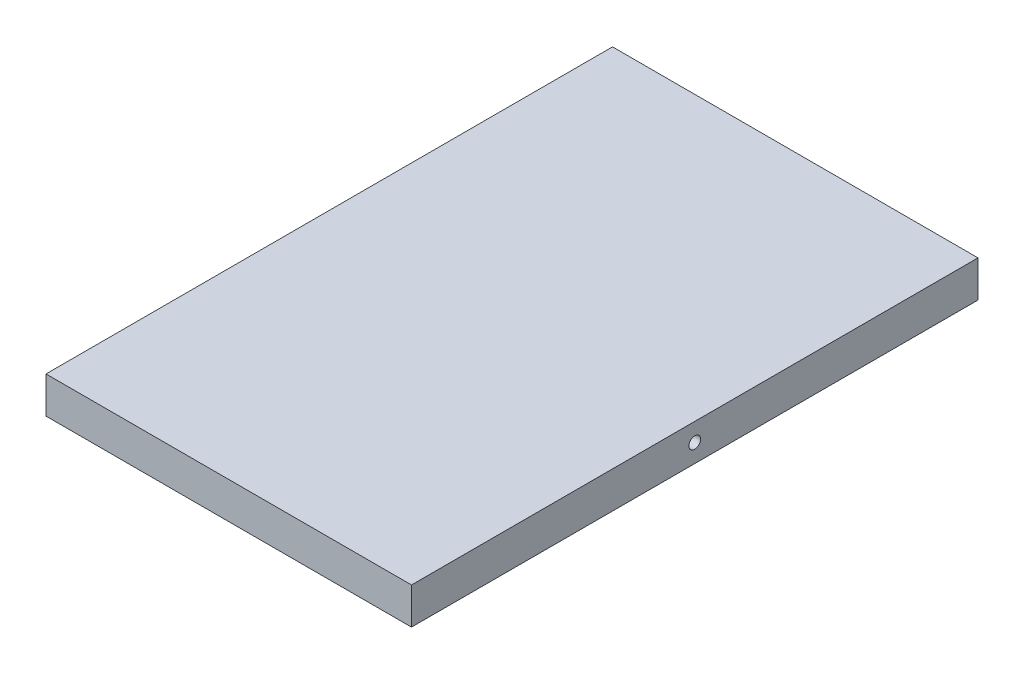
ISO-10303-21;
HEADER;
FILE_DESCRIPTION(('STEP AP214'),'2;1');
FILE_NAME('part.step','',(''),(''),'','','');
FILE_SCHEMA(('AUTOMOTIVE_DESIGN { 1 0 10303 214 1 1 1 1 }'));
ENDSEC;
DATA;
#1=APPLICATION_CONTEXT('core data for automotive mechanical design processes');
#2=APPLICATION_PROTOCOL_DEFINITION('international standard','automotive_design',2000,#1);
#3=PRODUCT_CONTEXT('',#1,'mechanical');
#4=PRODUCT('Part','Part','',(#3));
#5=PRODUCT_RELATED_PRODUCT_CATEGORY('part','',(#4));
#6=PRODUCT_DEFINITION_FORMATION('','',#4);
#7=PRODUCT_DEFINITION_CONTEXT('part definition',#1,'design');
#8=PRODUCT_DEFINITION('design','',#6,#7);
#9=PRODUCT_DEFINITION_SHAPE('','',#8);
#10=(LENGTH_UNIT() NAMED_UNIT(*) SI_UNIT(.MILLI.,.METRE.));
#11=(NAMED_UNIT(*) PLANE_ANGLE_UNIT() SI_UNIT($,.RADIAN.));
#12=(NAMED_UNIT(*) SI_UNIT($,.STERADIAN.) SOLID_ANGLE_UNIT());
#13=UNCERTAINTY_MEASURE_WITH_UNIT(LENGTH_MEASURE(1.E-05),#10,'distance_accuracy_value','');
#14=(GEOMETRIC_REPRESENTATION_CONTEXT(3) GLOBAL_UNCERTAINTY_ASSIGNED_CONTEXT((#13)) GLOBAL_UNIT_ASSIGNED_CONTEXT((#10,
#11,#12)) REPRESENTATION_CONTEXT('',''));
#15=CARTESIAN_POINT('',(0.,0.,0.));
#16=DIRECTION('',(0.,0.,1.));
#17=DIRECTION('',(1.,0.,0.));
#18=AXIS2_PLACEMENT_3D('',#15,#16,#17);
#19=CARTESIAN_POINT('',(0.,50.,0.));
#20=DIRECTION('',(1.,0.,0.));
#21=DIRECTION('',(0.,0.,-1.));
#22=AXIS2_PLACEMENT_3D('',#19,#20,#21);
#23=PLANE('',#22);
#24=CARTESIAN_POINT('',(0.,25.,-387.5));
#25=DIRECTION('',(-1.,0.,0.));
#26=DIRECTION('',(0.,0.,1.));
#27=AXIS2_PLACEMENT_3D('',#24,#25,#26);
#28=CIRCLE('',#27,7.99999999999998);
#29=CARTESIAN_POINT('',(0.,25.,-379.5));
#30=VERTEX_POINT('',#29);
#31=EDGE_CURVE('E170',#30,#30,#28,.T.);
#32=ORIENTED_EDGE('',*,*,#31,.F.);
#33=EDGE_LOOP('',(#32));
#34=FACE_BOUND('',#33,.T.);
#35=DIRECTION('',(0.,0.,1.));
#36=VECTOR('',#35,1.);
#37=CARTESIAN_POINT('',(0.,0.,0.));
#38=LINE('',#37,#36);
#39=CARTESIAN_POINT('',(0.,0.,-775.));
#40=VERTEX_POINT('',#39);
#41=CARTESIAN_POINT('',(0.,0.,0.));
#42=VERTEX_POINT('',#41);
#43=EDGE_CURVE('E101',#40,#42,#38,.T.);
#44=ORIENTED_EDGE('',*,*,#43,.T.);
#45=DIRECTION('',(0.,-1.,0.));
#46=VECTOR('',#45,1.);
#47=CARTESIAN_POINT('',(0.,50.,0.));
#48=LINE('',#47,#46);
#49=CARTESIAN_POINT('',(0.,50.,0.));
#50=VERTEX_POINT('',#49);
#51=EDGE_CURVE('E92',#50,#42,#48,.T.);
#52=ORIENTED_EDGE('',*,*,#51,.F.);
#53=DIRECTION('',(0.,0.,1.));
#54=VECTOR('',#53,1.);
#55=CARTESIAN_POINT('',(0.,50.,0.));
#56=LINE('',#55,#54);
#57=CARTESIAN_POINT('',(0.,50.,-775.));
#58=VERTEX_POINT('',#57);
#59=EDGE_CURVE('E86',#58,#50,#56,.T.);
#60=ORIENTED_EDGE('',*,*,#59,.F.);
#61=DIRECTION('',(0.,-1.,0.));
#62=VECTOR('',#61,1.);
#63=CARTESIAN_POINT('',(0.,50.,-775.));
#64=LINE('',#63,#62);
#65=EDGE_CURVE('E97',#58,#40,#64,.T.);
#66=ORIENTED_EDGE('',*,*,#65,.T.);
#67=EDGE_LOOP('',(#44,#52,#60,#66));
#68=FACE_BOUND('',#67,.T.);
#69=ADVANCED_FACE('F33',(#34,#68),#23,.F.);
#70=CARTESIAN_POINT('',(0.,50.,0.));
#71=DIRECTION('',(0.,0.,-1.));
#72=DIRECTION('',(-1.,0.,0.));
#73=AXIS2_PLACEMENT_3D('',#70,#71,#72);
#74=PLANE('',#73);
#75=DIRECTION('',(1.,0.,0.));
#76=VECTOR('',#75,1.);
#77=CARTESIAN_POINT('',(0.,0.,0.));
#78=LINE('',#77,#76);
#79=CARTESIAN_POINT('',(500.,0.,0.));
#80=VERTEX_POINT('',#79);
#81=EDGE_CURVE('E91',#42,#80,#78,.T.);
#82=ORIENTED_EDGE('',*,*,#81,.T.);
#83=DIRECTION('',(0.,-1.,0.));
#84=VECTOR('',#83,1.);
#85=CARTESIAN_POINT('',(500.,50.,0.));
#86=LINE('',#85,#84);
#87=CARTESIAN_POINT('',(500.,50.,0.));
#88=VERTEX_POINT('',#87);
#89=EDGE_CURVE('E89',#88,#80,#86,.T.);
#90=ORIENTED_EDGE('',*,*,#89,.F.);
#91=DIRECTION('',(1.,0.,0.));
#92=VECTOR('',#91,1.);
#93=CARTESIAN_POINT('',(0.,50.,0.));
#94=LINE('',#93,#92);
#95=EDGE_CURVE('E81',#50,#88,#94,.T.);
#96=ORIENTED_EDGE('',*,*,#95,.F.);
#97=ORIENTED_EDGE('',*,*,#51,.T.);
#98=EDGE_LOOP('',(#82,#90,#96,#97));
#99=FACE_BOUND('',#98,.T.);
#100=ADVANCED_FACE('F90',(#99),#74,.F.);
#101=CARTESIAN_POINT('',(500.,50.,0.));
#102=DIRECTION('',(-1.,0.,0.));
#103=DIRECTION('',(0.,0.,1.));
#104=AXIS2_PLACEMENT_3D('',#101,#102,#103);
#105=PLANE('',#104);
#106=CARTESIAN_POINT('',(500.,25.,-387.5));
#107=DIRECTION('',(1.,0.,0.));
#108=DIRECTION('',(0.,0.,-1.));
#109=AXIS2_PLACEMENT_3D('',#106,#107,#108);
#110=CIRCLE('',#109,7.99999999999998);
#111=CARTESIAN_POINT('',(500.,25.,-395.5));
#112=VERTEX_POINT('',#111);
#113=EDGE_CURVE('E177',#112,#112,#110,.T.);
#114=ORIENTED_EDGE('',*,*,#113,.F.);
#115=EDGE_LOOP('',(#114));
#116=FACE_BOUND('',#115,.T.);
#117=DIRECTION('',(0.,0.,-1.));
#118=VECTOR('',#117,1.);
#119=CARTESIAN_POINT('',(500.,0.,0.));
#120=LINE('',#119,#118);
#121=CARTESIAN_POINT('',(500.,0.,-775.));
#122=VERTEX_POINT('',#121);
#123=EDGE_CURVE('E67',#80,#122,#120,.T.);
#124=ORIENTED_EDGE('',*,*,#123,.T.);
#125=DIRECTION('',(0.,-1.,0.));
#126=VECTOR('',#125,1.);
#127=CARTESIAN_POINT('',(500.,50.,-775.));
#128=LINE('',#127,#126);
#129=CARTESIAN_POINT('',(500.,50.,-775.));
#130=VERTEX_POINT('',#129);
#131=EDGE_CURVE('E93',#130,#122,#128,.T.);
#132=ORIENTED_EDGE('',*,*,#131,.F.);
#133=DIRECTION('',(0.,0.,-1.));
#134=VECTOR('',#133,1.);
#135=CARTESIAN_POINT('',(500.,50.,0.));
#136=LINE('',#135,#134);
#137=EDGE_CURVE('E84',#88,#130,#136,.T.);
#138=ORIENTED_EDGE('',*,*,#137,.F.);
#139=ORIENTED_EDGE('',*,*,#89,.T.);
#140=EDGE_LOOP('',(#124,#132,#138,#139));
#141=FACE_BOUND('',#140,.T.);
#142=ADVANCED_FACE('F95',(#116,#141),#105,.F.);
#143=CARTESIAN_POINT('',(0.,50.,-775.));
#144=DIRECTION('',(0.,0.,1.));
#145=DIRECTION('',(1.,0.,0.));
#146=AXIS2_PLACEMENT_3D('',#143,#144,#145);
#147=PLANE('',#146);
#148=DIRECTION('',(-1.,0.,0.));
#149=VECTOR('',#148,1.);
#150=CARTESIAN_POINT('',(0.,0.,-775.));
#151=LINE('',#150,#149);
#152=EDGE_CURVE('E73',#122,#40,#151,.T.);
#153=ORIENTED_EDGE('',*,*,#152,.T.);
#154=ORIENTED_EDGE('',*,*,#65,.F.);
#155=DIRECTION('',(-1.,0.,0.));
#156=VECTOR('',#155,1.);
#157=CARTESIAN_POINT('',(0.,50.,-775.));
#158=LINE('',#157,#156);
#159=EDGE_CURVE('E50',#130,#58,#158,.T.);
#160=ORIENTED_EDGE('',*,*,#159,.F.);
#161=ORIENTED_EDGE('',*,*,#131,.T.);
#162=EDGE_LOOP('',(#153,#154,#160,#161));
#163=FACE_BOUND('',#162,.T.);
#164=ADVANCED_FACE('F136',(#163),#147,.F.);
#165=CARTESIAN_POINT('',(0.,50.,0.));
#166=DIRECTION('',(0.,-1.,0.));
#167=DIRECTION('',(0.,0.,-1.));
#168=AXIS2_PLACEMENT_3D('',#165,#166,#167);
#169=PLANE('',#168);
#170=ORIENTED_EDGE('',*,*,#59,.T.);
#171=ORIENTED_EDGE('',*,*,#95,.T.);
#172=ORIENTED_EDGE('',*,*,#137,.T.);
#173=ORIENTED_EDGE('',*,*,#159,.T.);
#174=EDGE_LOOP('',(#170,#171,#172,#173));
#175=FACE_BOUND('',#174,.T.);
#176=ADVANCED_FACE('F82',(#175),#169,.F.);
#177=CARTESIAN_POINT('',(0.,0.,0.));
#178=DIRECTION('',(0.,-1.,0.));
#179=DIRECTION('',(0.,0.,-1.));
#180=AXIS2_PLACEMENT_3D('',#177,#178,#179);
#181=PLANE('',#180);
#182=CARTESIAN_POINT('',(250.,0.,-100.));
#183=DIRECTION('',(0.,-1.,0.));
#184=DIRECTION('',(0.,0.,-1.));
#185=AXIS2_PLACEMENT_3D('',#182,#183,#184);
#186=CIRCLE('',#185,66.5482774756152);
#187=CARTESIAN_POINT('',(250.,0.,-166.548277475615));
#188=VERTEX_POINT('',#187);
#189=EDGE_CURVE('E169',#188,#188,#186,.T.);
#190=ORIENTED_EDGE('',*,*,#189,.F.);
#191=EDGE_LOOP('',(#190));
#192=FACE_BOUND('',#191,.T.);
#193=ORIENTED_EDGE('',*,*,#43,.F.);
#194=ORIENTED_EDGE('',*,*,#152,.F.);
#195=ORIENTED_EDGE('',*,*,#123,.F.);
#196=ORIENTED_EDGE('',*,*,#81,.F.);
#197=EDGE_LOOP('',(#193,#194,#195,#196));
#198=FACE_BOUND('',#197,.T.);
#199=ADVANCED_FACE('F140',(#192,#198),#181,.T.);
#200=CARTESIAN_POINT('',(455.,25.,-387.5));
#201=DIRECTION('',(1.,0.,0.));
#202=DIRECTION('',(0.,0.,-1.));
#203=AXIS2_PLACEMENT_3D('',#200,#201,#202);
#204=CYLINDRICAL_SURFACE('',#203,7.99999999999998);
#205=CARTESIAN_POINT('',(455.,25.,-387.5));
#206=DIRECTION('',(1.,0.,0.));
#207=DIRECTION('',(0.,0.,-1.));
#208=AXIS2_PLACEMENT_3D('',#205,#206,#207);
#209=CIRCLE('',#208,7.99999999999998);
#210=CARTESIAN_POINT('',(455.,25.,-395.5));
#211=VERTEX_POINT('',#210);
#212=EDGE_CURVE('E104',#211,#211,#209,.T.);
#213=CARTESIAN_POINT('',(455.,25.,-395.5));
#214=CARTESIAN_POINT('',(455.46875,25.,-395.5));
#215=CARTESIAN_POINT('',(455.9375,25.,-395.5));
#216=CARTESIAN_POINT('',(456.875,25.,-395.5));
#217=CARTESIAN_POINT('',(457.34375,25.,-395.5));
#218=CARTESIAN_POINT('',(458.28125,25.,-395.5));
#219=CARTESIAN_POINT('',(458.75,25.,-395.5));
#220=CARTESIAN_POINT('',(459.6875,25.,-395.5));
#221=CARTESIAN_POINT('',(460.15625,25.,-395.5));
#222=CARTESIAN_POINT('',(461.09375,25.,-395.5));
#223=CARTESIAN_POINT('',(461.5625,25.,-395.5));
#224=CARTESIAN_POINT('',(462.5,25.,-395.5));
#225=CARTESIAN_POINT('',(462.96875,25.,-395.5));
#226=CARTESIAN_POINT('',(463.90625,25.,-395.5));
#227=CARTESIAN_POINT('',(464.375,25.,-395.5));
#228=CARTESIAN_POINT('',(465.3125,25.,-395.5));
#229=CARTESIAN_POINT('',(465.78125,25.,-395.5));
#230=CARTESIAN_POINT('',(466.71875,25.,-395.5));
#231=CARTESIAN_POINT('',(467.1875,25.,-395.5));
#232=CARTESIAN_POINT('',(468.125,25.,-395.5));
#233=CARTESIAN_POINT('',(468.59375,25.,-395.5));
#234=CARTESIAN_POINT('',(469.53125,25.,-395.5));
#235=CARTESIAN_POINT('',(470.,25.,-395.5));
#236=CARTESIAN_POINT('',(470.9375,25.,-395.5));
#237=CARTESIAN_POINT('',(471.40625,25.,-395.5));
#238=CARTESIAN_POINT('',(472.34375,25.,-395.5));
#239=CARTESIAN_POINT('',(472.8125,25.,-395.5));
#240=CARTESIAN_POINT('',(473.75,25.,-395.5));
#241=CARTESIAN_POINT('',(474.21875,25.,-395.5));
#242=CARTESIAN_POINT('',(475.15625,25.,-395.5));
#243=CARTESIAN_POINT('',(475.625,25.,-395.5));
#244=CARTESIAN_POINT('',(476.5625,25.,-395.5));
#245=CARTESIAN_POINT('',(477.03125,25.,-395.5));
#246=CARTESIAN_POINT('',(477.96875,25.,-395.5));
#247=CARTESIAN_POINT('',(478.4375,25.,-395.5));
#248=CARTESIAN_POINT('',(479.375,25.,-395.5));
#249=CARTESIAN_POINT('',(479.84375,25.,-395.5));
#250=CARTESIAN_POINT('',(480.78125,25.,-395.5));
#251=CARTESIAN_POINT('',(481.25,25.,-395.5));
#252=CARTESIAN_POINT('',(482.1875,25.,-395.5));
#253=CARTESIAN_POINT('',(482.65625,25.,-395.5));
#254=CARTESIAN_POINT('',(483.59375,25.,-395.5));
#255=CARTESIAN_POINT('',(484.0625,25.,-395.5));
#256=CARTESIAN_POINT('',(485.,25.,-395.5));
#257=CARTESIAN_POINT('',(485.46875,25.,-395.5));
#258=CARTESIAN_POINT('',(486.40625,25.,-395.5));
#259=CARTESIAN_POINT('',(486.875,25.,-395.5));
#260=CARTESIAN_POINT('',(487.8125,25.,-395.5));
#261=CARTESIAN_POINT('',(488.28125,25.,-395.5));
#262=CARTESIAN_POINT('',(489.21875,25.,-395.5));
#263=CARTESIAN_POINT('',(489.6875,25.,-395.5));
#264=CARTESIAN_POINT('',(490.625,25.,-395.5));
#265=CARTESIAN_POINT('',(491.09375,25.,-395.5));
#266=CARTESIAN_POINT('',(492.03125,25.,-395.5));
#267=CARTESIAN_POINT('',(492.5,25.,-395.5));
#268=CARTESIAN_POINT('',(493.4375,25.,-395.5));
#269=CARTESIAN_POINT('',(493.90625,25.,-395.5));
#270=CARTESIAN_POINT('',(494.84375,25.,-395.5));
#271=CARTESIAN_POINT('',(495.3125,25.,-395.5));
#272=CARTESIAN_POINT('',(496.25,25.,-395.5));
#273=CARTESIAN_POINT('',(496.71875,25.,-395.5));
#274=CARTESIAN_POINT('',(497.65625,25.,-395.5));
#275=CARTESIAN_POINT('',(498.125,25.,-395.5));
#276=CARTESIAN_POINT('',(499.0625,25.,-395.5));
#277=CARTESIAN_POINT('',(499.53125,25.,-395.5));
#278=CARTESIAN_POINT('',(500.,25.,-395.5));
#279=B_SPLINE_CURVE_WITH_KNOTS('',3,(#213,#214,#215,#216,#217,#218,#219,#220,#221,#222,#223,
#224,#225,#226,#227,#228,#229,#230,#231,#232,#233,#234,#235,#236,#237,#238,#239,#240,#241,#242,
#243,#244,#245,#246,#247,#248,#249,#250,#251,#252,#253,#254,#255,#256,#257,#258,#259,#260,#261,
#262,#263,#264,#265,#266,#267,#268,#269,#270,#271,#272,#273,#274,#275,#276,#277,#278),
.UNSPECIFIED.,.F.,.F.,(4,2,2,2,2,2,2,2,2,2,2,2,2,2,2,2,2,2,2,2,2,2,2,2,2,2,2,2,2,2,2,2,4),(0.,
1.40625,2.8125,4.21874999999999,5.62499999999999,7.03124999999999,8.43749999999999,
9.84374999999998,11.25,12.65625,14.0625,15.46875,16.875,18.28125,19.6875,21.09375,22.5,23.90625,
25.3125,26.71875,28.125,29.53125,30.9375,32.34375,33.7499999999999,35.1562499999999,
36.5624999999999,37.9687499999999,39.3749999999999,40.7812499999999,42.1874999999999,
43.5937499999999,44.9999999999999),.UNSPECIFIED.);
#280=EDGE_CURVE('BSEAM143',#211,#112,#279,.T.);
#281=ORIENTED_EDGE('',*,*,#212,.F.);
#282=ORIENTED_EDGE('',*,*,#113,.T.);
#283=ORIENTED_EDGE('',*,*,#280,.T.);
#284=ORIENTED_EDGE('',*,*,#280,.F.);
#285=EDGE_LOOP('',(#281,#283,#282,#284));
#286=FACE_BOUND('',#285,.T.);
#287=ADVANCED_FACE('F143',(#286),#204,.F.);
#288=CARTESIAN_POINT('',(455.,25.,-387.5));
#289=DIRECTION('',(1.,0.,0.));
#290=DIRECTION('',(0.,0.,-1.));
#291=AXIS2_PLACEMENT_3D('',#288,#289,#290);
#292=PLANE('',#291);
#293=ORIENTED_EDGE('',*,*,#212,.T.);
#294=EDGE_LOOP('',(#293));
#295=FACE_BOUND('',#294,.T.);
#296=ADVANCED_FACE('F149',(#295),#292,.T.);
#297=CARTESIAN_POINT('',(45.,25.,-387.5));
#298=DIRECTION('',(-1.,0.,0.));
#299=DIRECTION('',(0.,0.,1.));
#300=AXIS2_PLACEMENT_3D('',#297,#298,#299);
#301=CYLINDRICAL_SURFACE('',#300,7.99999999999998);
#302=CARTESIAN_POINT('',(45.,25.,-387.5));
#303=DIRECTION('',(-1.,0.,0.));
#304=DIRECTION('',(0.,0.,1.));
#305=AXIS2_PLACEMENT_3D('',#302,#303,#304);
#306=CIRCLE('',#305,7.99999999999998);
#307=CARTESIAN_POINT('',(45.,25.,-379.5));
#308=VERTEX_POINT('',#307);
#309=EDGE_CURVE('E173',#308,#308,#306,.T.);
#310=CARTESIAN_POINT('',(45.,25.,-379.5));
#311=CARTESIAN_POINT('',(44.53125,25.,-379.5));
#312=CARTESIAN_POINT('',(44.0625,25.,-379.5));
#313=CARTESIAN_POINT('',(43.125,25.,-379.5));
#314=CARTESIAN_POINT('',(42.65625,25.,-379.5));
#315=CARTESIAN_POINT('',(41.71875,25.,-379.5));
#316=CARTESIAN_POINT('',(41.25,25.,-379.5));
#317=CARTESIAN_POINT('',(40.3125,25.,-379.5));
#318=CARTESIAN_POINT('',(39.84375,25.,-379.5));
#319=CARTESIAN_POINT('',(38.90625,25.,-379.5));
#320=CARTESIAN_POINT('',(38.4375,25.,-379.5));
#321=CARTESIAN_POINT('',(37.5,25.,-379.5));
#322=CARTESIAN_POINT('',(37.03125,25.,-379.5));
#323=CARTESIAN_POINT('',(36.09375,25.,-379.5));
#324=CARTESIAN_POINT('',(35.625,25.,-379.5));
#325=CARTESIAN_POINT('',(34.6875,25.,-379.5));
#326=CARTESIAN_POINT('',(34.21875,25.,-379.5));
#327=CARTESIAN_POINT('',(33.28125,25.,-379.5));
#328=CARTESIAN_POINT('',(32.8125,25.,-379.5));
#329=CARTESIAN_POINT('',(31.875,25.,-379.5));
#330=CARTESIAN_POINT('',(31.40625,25.,-379.5));
#331=CARTESIAN_POINT('',(30.46875,25.,-379.5));
#332=CARTESIAN_POINT('',(30.,25.,-379.5));
#333=CARTESIAN_POINT('',(29.0625,25.,-379.5));
#334=CARTESIAN_POINT('',(28.59375,25.,-379.5));
#335=CARTESIAN_POINT('',(27.65625,25.,-379.5));
#336=CARTESIAN_POINT('',(27.1875,25.,-379.5));
#337=CARTESIAN_POINT('',(26.25,25.,-379.5));
#338=CARTESIAN_POINT('',(25.78125,25.,-379.5));
#339=CARTESIAN_POINT('',(24.84375,25.,-379.5));
#340=CARTESIAN_POINT('',(24.375,25.,-379.5));
#341=CARTESIAN_POINT('',(23.4375,25.,-379.5));
#342=CARTESIAN_POINT('',(22.96875,25.,-379.5));
#343=CARTESIAN_POINT('',(22.03125,25.,-379.5));
#344=CARTESIAN_POINT('',(21.5625,25.,-379.5));
#345=CARTESIAN_POINT('',(20.625,25.,-379.5));
#346=CARTESIAN_POINT('',(20.15625,25.,-379.5));
#347=CARTESIAN_POINT('',(19.21875,25.,-379.5));
#348=CARTESIAN_POINT('',(18.75,25.,-379.5));
#349=CARTESIAN_POINT('',(17.8125,25.,-379.5));
#350=CARTESIAN_POINT('',(17.34375,25.,-379.5));
#351=CARTESIAN_POINT('',(16.40625,25.,-379.5));
#352=CARTESIAN_POINT('',(15.9375,25.,-379.5));
#353=CARTESIAN_POINT('',(15.,25.,-379.5));
#354=CARTESIAN_POINT('',(14.53125,25.,-379.5));
#355=CARTESIAN_POINT('',(13.59375,25.,-379.5));
#356=CARTESIAN_POINT('',(13.125,25.,-379.5));
#357=CARTESIAN_POINT('',(12.1875,25.,-379.5));
#358=CARTESIAN_POINT('',(11.71875,25.,-379.5));
#359=CARTESIAN_POINT('',(10.78125,25.,-379.5));
#360=CARTESIAN_POINT('',(10.3125,25.,-379.5));
#361=CARTESIAN_POINT('',(9.37500000000001,25.,-379.5));
#362=CARTESIAN_POINT('',(8.90625000000001,25.,-379.5));
#363=CARTESIAN_POINT('',(7.96875000000001,25.,-379.5));
#364=CARTESIAN_POINT('',(7.50000000000001,25.,-379.5));
#365=CARTESIAN_POINT('',(6.56250000000001,25.,-379.5));
#366=CARTESIAN_POINT('',(6.09375000000001,25.,-379.5));
#367=CARTESIAN_POINT('',(5.15625000000001,25.,-379.5));
#368=CARTESIAN_POINT('',(4.68750000000001,25.,-379.5));
#369=CARTESIAN_POINT('',(3.75000000000001,25.,-379.5));
#370=CARTESIAN_POINT('',(3.28125000000001,25.,-379.5));
#371=CARTESIAN_POINT('',(2.34375000000001,25.,-379.5));
#372=CARTESIAN_POINT('',(1.87500000000001,25.,-379.5));
#373=CARTESIAN_POINT('',(0.937500000000006,25.,-379.5));
#374=CARTESIAN_POINT('',(0.468750000000007,25.,-379.5));
#375=CARTESIAN_POINT('',(0.,25.,-379.5));
#376=B_SPLINE_CURVE_WITH_KNOTS('',3,(#310,#311,#312,#313,#314,#315,#316,#317,#318,#319,#320,
#321,#322,#323,#324,#325,#326,#327,#328,#329,#330,#331,#332,#333,#334,#335,#336,#337,#338,#339,
#340,#341,#342,#343,#344,#345,#346,#347,#348,#349,#350,#351,#352,#353,#354,#355,#356,#357,#358,
#359,#360,#361,#362,#363,#364,#365,#366,#367,#368,#369,#370,#371,#372,#373,#374,#375),
.UNSPECIFIED.,.F.,.F.,(4,2,2,2,2,2,2,2,2,2,2,2,2,2,2,2,2,2,2,2,2,2,2,2,2,2,2,2,2,2,2,2,4),(0.,
1.40625,2.8125,4.21874999999999,5.625,7.03125,8.43749999999999,9.84375,11.25,12.65625,14.0625,
15.46875,16.875,18.28125,19.6875,21.09375,22.5,23.90625,25.3125,26.71875,28.125,29.53125,
30.9375,32.34375,33.75,35.15625,36.5625,37.96875,39.375,40.78125,42.1875,43.59375,45.),.UNSPECIFIED.);
#377=EDGE_CURVE('BSEAM153',#308,#30,#376,.T.);
#378=ORIENTED_EDGE('',*,*,#309,.F.);
#379=ORIENTED_EDGE('',*,*,#31,.T.);
#380=ORIENTED_EDGE('',*,*,#377,.T.);
#381=ORIENTED_EDGE('',*,*,#377,.F.);
#382=EDGE_LOOP('',(#378,#380,#379,#381));
#383=FACE_BOUND('',#382,.T.);
#384=ADVANCED_FACE('F153',(#383),#301,.F.);
#385=CARTESIAN_POINT('',(45.,25.,-387.5));
#386=DIRECTION('',(-1.,0.,0.));
#387=DIRECTION('',(0.,0.,1.));
#388=AXIS2_PLACEMENT_3D('',#385,#386,#387);
#389=PLANE('',#388);
#390=ORIENTED_EDGE('',*,*,#309,.T.);
#391=EDGE_LOOP('',(#390));
#392=FACE_BOUND('',#391,.T.);
#393=ADVANCED_FACE('F157',(#392),#389,.T.);
#394=CARTESIAN_POINT('',(250.,-60.75,-100.));
#395=DIRECTION('',(0.,1.,0.));
#396=DIRECTION('',(0.,0.,1.));
#397=AXIS2_PLACEMENT_3D('',#394,#395,#396);
#398=CYLINDRICAL_SURFACE('',#397,66.5482774756152);
#399=CARTESIAN_POINT('',(250.,-0.749999999999994,-100.));
#400=DIRECTION('',(0.,-1.,0.));
#401=DIRECTION('',(0.,0.,-1.));
#402=AXIS2_PLACEMENT_3D('',#399,#400,#401);
#403=CIRCLE('',#402,66.5482774756152);
#404=CARTESIAN_POINT('',(250.,-0.749999999999994,-166.548277475615));
#405=VERTEX_POINT('',#404);
#406=EDGE_CURVE('E11',#405,#405,#403,.F.);
#407=ORIENTED_EDGE('',*,*,#406,.T.);
#408=EDGE_LOOP('',(#407));
#409=FACE_BOUND('',#408,.T.);
#410=ORIENTED_EDGE('',*,*,#189,.T.);
#411=EDGE_LOOP('',(#410));
#412=FACE_BOUND('',#411,.T.);
#413=ADVANCED_FACE('F120',(#409,#412),#398,.T.);
#414=CARTESIAN_POINT('',(250.,-60.75,-100.));
#415=DIRECTION('',(0.,-1.,0.));
#416=DIRECTION('',(0.,0.,-1.));
#417=AXIS2_PLACEMENT_3D('',#414,#415,#416);
#418=PLANE('',#417);
#419=CARTESIAN_POINT('',(250.,-60.75,-100.));
#420=DIRECTION('',(0.,-1.,0.));
#421=DIRECTION('',(0.,0.,-1.));
#422=AXIS2_PLACEMENT_3D('',#419,#420,#421);
#423=CIRCLE('',#422,6.54827747561516);
#424=CARTESIAN_POINT('',(250.,-60.75,-106.548277475615));
#425=VERTEX_POINT('',#424);
#426=EDGE_CURVE('E42',#425,#425,#423,.T.);
#427=ORIENTED_EDGE('',*,*,#426,.T.);
#428=EDGE_LOOP('',(#427));
#429=FACE_BOUND('',#428,.T.);
#430=ADVANCED_FACE('F113',(#429),#418,.T.);
#431=CARTESIAN_POINT('',(250.,-0.749999999999994,-100.));
#432=DIRECTION('',(0.,-1.,0.));
#433=DIRECTION('',(0.,0.,-1.));
#434=AXIS2_PLACEMENT_3D('',#431,#432,#433);
#435=DEGENERATE_TOROIDAL_SURFACE('',#434,6.54827747561516,60.,.T.);
#436=ORIENTED_EDGE('',*,*,#406,.F.);
#437=EDGE_LOOP('',(#436));
#438=FACE_BOUND('',#437,.T.);
#439=ORIENTED_EDGE('',*,*,#426,.F.);
#440=EDGE_LOOP('',(#439));
#441=FACE_BOUND('',#440,.T.);
#442=ADVANCED_FACE('F35',(#438,#441),#435,.T.);
#443=CLOSED_SHELL('',(#69,#100,#142,#164,#176,#199,#287,#296,#384,#393,#413,#430,#442));
#444=MANIFOLD_SOLID_BREP('B2',#443);
#445=ADVANCED_BREP_SHAPE_REPRESENTATION('',(#18,#444),#14);
#446=SHAPE_DEFINITION_REPRESENTATION(#9,#445);
ENDSEC;
END-ISO-10303-21;
